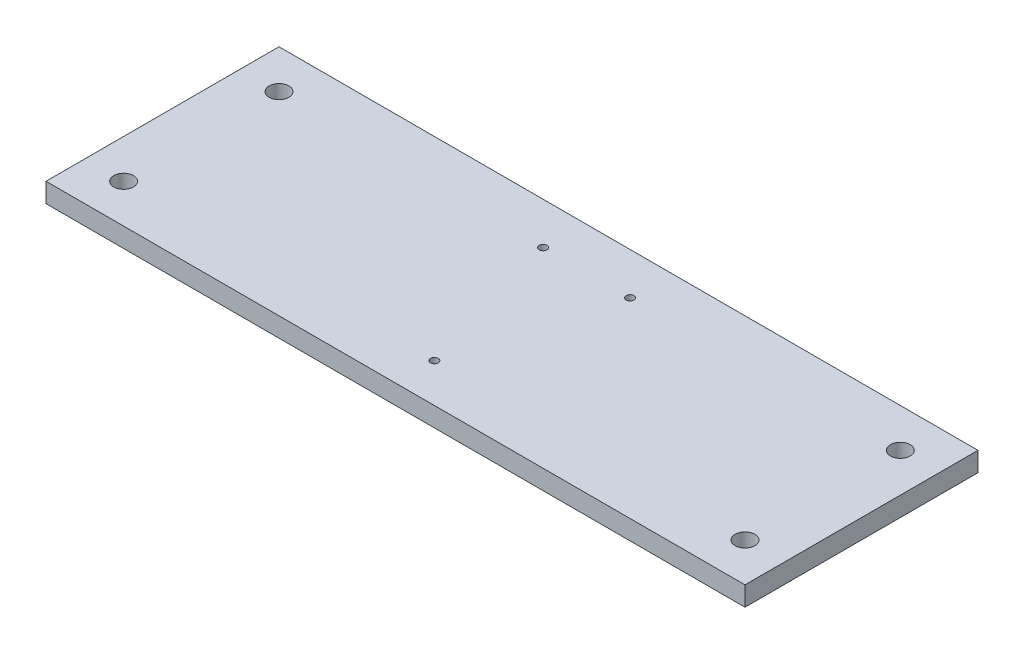
ISO-10303-21;
HEADER;
FILE_DESCRIPTION(('STEP AP214'),'2;1');
FILE_NAME('part.step','',(''),(''),'','','');
FILE_SCHEMA(('AUTOMOTIVE_DESIGN { 1 0 10303 214 1 1 1 1 }'));
ENDSEC;
DATA;
#1=APPLICATION_CONTEXT('core data for automotive mechanical design processes');
#2=APPLICATION_PROTOCOL_DEFINITION('international standard','automotive_design',2000,#1);
#3=PRODUCT_CONTEXT('',#1,'mechanical');
#4=PRODUCT('Part','Part','',(#3));
#5=PRODUCT_RELATED_PRODUCT_CATEGORY('part','',(#4));
#6=PRODUCT_DEFINITION_FORMATION('','',#4);
#7=PRODUCT_DEFINITION_CONTEXT('part definition',#1,'design');
#8=PRODUCT_DEFINITION('design','',#6,#7);
#9=PRODUCT_DEFINITION_SHAPE('','',#8);
#10=(LENGTH_UNIT() NAMED_UNIT(*) SI_UNIT(.MILLI.,.METRE.));
#11=(NAMED_UNIT(*) PLANE_ANGLE_UNIT() SI_UNIT($,.RADIAN.));
#12=(NAMED_UNIT(*) SI_UNIT($,.STERADIAN.) SOLID_ANGLE_UNIT());
#13=UNCERTAINTY_MEASURE_WITH_UNIT(LENGTH_MEASURE(1.E-05),#10,'distance_accuracy_value','');
#14=(GEOMETRIC_REPRESENTATION_CONTEXT(3) GLOBAL_UNCERTAINTY_ASSIGNED_CONTEXT((#13)) GLOBAL_UNIT_ASSIGNED_CONTEXT((#10,
#11,#12)) REPRESENTATION_CONTEXT('',''));
#15=CARTESIAN_POINT('',(0.,0.,0.));
#16=DIRECTION('',(0.,0.,1.));
#17=DIRECTION('',(1.,0.,0.));
#18=AXIS2_PLACEMENT_3D('',#15,#16,#17);
#19=CARTESIAN_POINT('',(0.,6.35,0.));
#20=DIRECTION('',(0.,1.,0.));
#21=DIRECTION('',(0.,0.,1.));
#22=AXIS2_PLACEMENT_3D('',#19,#20,#21);
#23=PLANE('',#22);
#24=CARTESIAN_POINT('',(101.600000000001,6.35,25.4000000000001));
#25=DIRECTION('',(0.,1.,0.));
#26=DIRECTION('',(0.,0.,1.));
#27=AXIS2_PLACEMENT_3D('',#24,#25,#26);
#28=CIRCLE('',#27,3.22807216755904);
#29=CARTESIAN_POINT('',(101.600000000001,6.35,28.6280721675591));
#30=VERTEX_POINT('',#29);
#31=EDGE_CURVE('E139',#30,#30,#28,.T.);
#32=ORIENTED_EDGE('',*,*,#31,.F.);
#33=EDGE_LOOP('',(#32));
#34=FACE_BOUND('',#33,.T.);
#35=CARTESIAN_POINT('',(-101.6,6.35,-25.3999999999999));
#36=DIRECTION('',(0.,1.,0.));
#37=DIRECTION('',(0.,0.,1.));
#38=AXIS2_PLACEMENT_3D('',#35,#36,#37);
#39=CIRCLE('',#38,3.22807216755905);
#40=CARTESIAN_POINT('',(-101.6,6.35,-22.1719278324409));
#41=VERTEX_POINT('',#40);
#42=EDGE_CURVE('E127',#41,#41,#39,.T.);
#43=ORIENTED_EDGE('',*,*,#42,.F.);
#44=EDGE_LOOP('',(#43));
#45=FACE_BOUND('',#44,.T.);
#46=CARTESIAN_POINT('',(14.226267712,6.35,-24.3941599999999));
#47=DIRECTION('',(0.,1.,0.));
#48=DIRECTION('',(0.,0.,1.));
#49=AXIS2_PLACEMENT_3D('',#46,#47,#48);
#50=CIRCLE('',#49,1.27);
#51=CARTESIAN_POINT('',(14.226267712,6.35,-23.1241599999999));
#52=VERTEX_POINT('',#51);
#53=EDGE_CURVE('E115',#52,#52,#50,.T.);
#54=ORIENTED_EDGE('',*,*,#53,.F.);
#55=EDGE_LOOP('',(#54));
#56=FACE_BOUND('',#55,.T.);
#57=DIRECTION('',(0.,0.,1.));
#58=VECTOR('',#57,1.);
#59=CARTESIAN_POINT('',(-114.3,6.35,38.1));
#60=LINE('',#59,#58);
#61=CARTESIAN_POINT('',(-114.3,6.35,-38.1));
#62=VERTEX_POINT('',#61);
#63=CARTESIAN_POINT('',(-114.3,6.35,38.1));
#64=VERTEX_POINT('',#63);
#65=EDGE_CURVE('E85',#62,#64,#60,.T.);
#66=ORIENTED_EDGE('',*,*,#65,.T.);
#67=DIRECTION('',(1.,0.,0.));
#68=VECTOR('',#67,1.);
#69=CARTESIAN_POINT('',(114.3,6.35,38.1));
#70=LINE('',#69,#68);
#71=CARTESIAN_POINT('',(114.3,6.35,38.1));
#72=VERTEX_POINT('',#71);
#73=EDGE_CURVE('E80',#64,#72,#70,.T.);
#74=ORIENTED_EDGE('',*,*,#73,.T.);
#75=DIRECTION('',(0.,0.,-1.));
#76=VECTOR('',#75,1.);
#77=CARTESIAN_POINT('',(114.3,6.35,38.1));
#78=LINE('',#77,#76);
#79=CARTESIAN_POINT('',(114.3,6.35,-38.1));
#80=VERTEX_POINT('',#79);
#81=EDGE_CURVE('E83',#72,#80,#78,.T.);
#82=ORIENTED_EDGE('',*,*,#81,.T.);
#83=DIRECTION('',(-1.,0.,0.));
#84=VECTOR('',#83,1.);
#85=CARTESIAN_POINT('',(114.3,6.35,-38.1));
#86=LINE('',#85,#84);
#87=EDGE_CURVE('E50',#80,#62,#86,.T.);
#88=ORIENTED_EDGE('',*,*,#87,.T.);
#89=EDGE_LOOP('',(#66,#74,#82,#88));
#90=FACE_BOUND('',#89,.T.);
#91=CARTESIAN_POINT('',(-14.226267712,6.35,-24.3941599999999));
#92=DIRECTION('',(0.,1.,0.));
#93=DIRECTION('',(0.,0.,1.));
#94=AXIS2_PLACEMENT_3D('',#91,#92,#93);
#95=CIRCLE('',#94,1.27);
#96=CARTESIAN_POINT('',(-14.226267712,6.35,-23.1241599999999));
#97=VERTEX_POINT('',#96);
#98=EDGE_CURVE('E100',#97,#97,#95,.T.);
#99=ORIENTED_EDGE('',*,*,#98,.F.);
#100=EDGE_LOOP('',(#99));
#101=FACE_BOUND('',#100,.T.);
#102=CARTESIAN_POINT('',(0.,6.35,25.4000000000001));
#103=DIRECTION('',(0.,1.,0.));
#104=DIRECTION('',(0.,0.,1.));
#105=AXIS2_PLACEMENT_3D('',#102,#103,#104);
#106=CIRCLE('',#105,1.27);
#107=CARTESIAN_POINT('',(0.,6.35,26.6700000000001));
#108=VERTEX_POINT('',#107);
#109=EDGE_CURVE('E121',#108,#108,#106,.T.);
#110=ORIENTED_EDGE('',*,*,#109,.F.);
#111=EDGE_LOOP('',(#110));
#112=FACE_BOUND('',#111,.T.);
#113=CARTESIAN_POINT('',(101.6,6.35,-25.3999999999999));
#114=DIRECTION('',(0.,1.,0.));
#115=DIRECTION('',(0.,0.,1.));
#116=AXIS2_PLACEMENT_3D('',#113,#114,#115);
#117=CIRCLE('',#116,3.22807216755904);
#118=CARTESIAN_POINT('',(101.6,6.35,-22.1719278324409));
#119=VERTEX_POINT('',#118);
#120=EDGE_CURVE('E133',#119,#119,#117,.T.);
#121=ORIENTED_EDGE('',*,*,#120,.F.);
#122=EDGE_LOOP('',(#121));
#123=FACE_BOUND('',#122,.T.);
#124=CARTESIAN_POINT('',(-101.599999999999,6.35,25.4000000000001));
#125=DIRECTION('',(0.,1.,0.));
#126=DIRECTION('',(0.,0.,1.));
#127=AXIS2_PLACEMENT_3D('',#124,#125,#126);
#128=CIRCLE('',#127,3.22807216755905);
#129=CARTESIAN_POINT('',(-101.599999999999,6.35,28.6280721675591));
#130=VERTEX_POINT('',#129);
#131=EDGE_CURVE('E145',#130,#130,#128,.T.);
#132=ORIENTED_EDGE('',*,*,#131,.F.);
#133=EDGE_LOOP('',(#132));
#134=FACE_BOUND('',#133,.T.);
#135=ADVANCED_FACE('F33',(#34,#45,#56,#90,#101,#112,#123,#134),#23,.T.);
#136=CARTESIAN_POINT('',(0.,0.,0.));
#137=DIRECTION('',(0.,1.,0.));
#138=DIRECTION('',(0.,0.,1.));
#139=AXIS2_PLACEMENT_3D('',#136,#137,#138);
#140=PLANE('',#139);
#141=DIRECTION('',(0.,0.,1.));
#142=VECTOR('',#141,1.);
#143=CARTESIAN_POINT('',(-114.3,0.,38.1));
#144=LINE('',#143,#142);
#145=CARTESIAN_POINT('',(-114.3,0.,-38.1));
#146=VERTEX_POINT('',#145);
#147=CARTESIAN_POINT('',(-114.3,0.,38.1));
#148=VERTEX_POINT('',#147);
#149=EDGE_CURVE('E97',#146,#148,#144,.T.);
#150=ORIENTED_EDGE('',*,*,#149,.F.);
#151=DIRECTION('',(-1.,0.,0.));
#152=VECTOR('',#151,1.);
#153=CARTESIAN_POINT('',(114.3,0.,-38.1));
#154=LINE('',#153,#152);
#155=CARTESIAN_POINT('',(114.3,0.,-38.1));
#156=VERTEX_POINT('',#155);
#157=EDGE_CURVE('E73',#156,#146,#154,.T.);
#158=ORIENTED_EDGE('',*,*,#157,.F.);
#159=DIRECTION('',(0.,0.,-1.));
#160=VECTOR('',#159,1.);
#161=CARTESIAN_POINT('',(114.3,0.,38.1));
#162=LINE('',#161,#160);
#163=CARTESIAN_POINT('',(114.3,0.,38.1));
#164=VERTEX_POINT('',#163);
#165=EDGE_CURVE('E67',#164,#156,#162,.T.);
#166=ORIENTED_EDGE('',*,*,#165,.F.);
#167=DIRECTION('',(1.,0.,0.));
#168=VECTOR('',#167,1.);
#169=CARTESIAN_POINT('',(114.3,0.,38.1));
#170=LINE('',#169,#168);
#171=EDGE_CURVE('E89',#148,#164,#170,.T.);
#172=ORIENTED_EDGE('',*,*,#171,.F.);
#173=EDGE_LOOP('',(#150,#158,#166,#172));
#174=FACE_BOUND('',#173,.T.);
#175=CARTESIAN_POINT('',(-14.226267712,0.,-24.3941599999999));
#176=DIRECTION('',(0.,1.,0.));
#177=DIRECTION('',(0.,0.,1.));
#178=AXIS2_PLACEMENT_3D('',#175,#176,#177);
#179=CIRCLE('',#178,1.27);
#180=CARTESIAN_POINT('',(-14.226267712,0.,-23.1241599999999));
#181=VERTEX_POINT('',#180);
#182=EDGE_CURVE('E112',#181,#181,#179,.T.);
#183=ORIENTED_EDGE('',*,*,#182,.T.);
#184=EDGE_LOOP('',(#183));
#185=FACE_BOUND('',#184,.T.);
#186=CARTESIAN_POINT('',(14.226267712,0.,-24.3941599999999));
#187=DIRECTION('',(0.,1.,0.));
#188=DIRECTION('',(0.,0.,1.));
#189=AXIS2_PLACEMENT_3D('',#186,#187,#188);
#190=CIRCLE('',#189,1.27);
#191=CARTESIAN_POINT('',(14.226267712,0.,-23.1241599999999));
#192=VERTEX_POINT('',#191);
#193=EDGE_CURVE('E118',#192,#192,#190,.T.);
#194=ORIENTED_EDGE('',*,*,#193,.T.);
#195=EDGE_LOOP('',(#194));
#196=FACE_BOUND('',#195,.T.);
#197=CARTESIAN_POINT('',(0.,0.,25.4000000000001));
#198=DIRECTION('',(0.,1.,0.));
#199=DIRECTION('',(0.,0.,1.));
#200=AXIS2_PLACEMENT_3D('',#197,#198,#199);
#201=CIRCLE('',#200,1.27);
#202=CARTESIAN_POINT('',(0.,0.,26.6700000000001));
#203=VERTEX_POINT('',#202);
#204=EDGE_CURVE('E124',#203,#203,#201,.T.);
#205=ORIENTED_EDGE('',*,*,#204,.T.);
#206=EDGE_LOOP('',(#205));
#207=FACE_BOUND('',#206,.T.);
#208=CARTESIAN_POINT('',(-101.6,0.,-25.3999999999999));
#209=DIRECTION('',(0.,1.,0.));
#210=DIRECTION('',(0.,0.,1.));
#211=AXIS2_PLACEMENT_3D('',#208,#209,#210);
#212=CIRCLE('',#211,3.22807216755905);
#213=CARTESIAN_POINT('',(-101.6,0.,-22.1719278324409));
#214=VERTEX_POINT('',#213);
#215=EDGE_CURVE('E130',#214,#214,#212,.T.);
#216=ORIENTED_EDGE('',*,*,#215,.T.);
#217=EDGE_LOOP('',(#216));
#218=FACE_BOUND('',#217,.T.);
#219=CARTESIAN_POINT('',(101.6,0.,-25.3999999999999));
#220=DIRECTION('',(0.,1.,0.));
#221=DIRECTION('',(0.,0.,1.));
#222=AXIS2_PLACEMENT_3D('',#219,#220,#221);
#223=CIRCLE('',#222,3.22807216755904);
#224=CARTESIAN_POINT('',(101.6,0.,-22.1719278324409));
#225=VERTEX_POINT('',#224);
#226=EDGE_CURVE('E136',#225,#225,#223,.T.);
#227=ORIENTED_EDGE('',*,*,#226,.T.);
#228=EDGE_LOOP('',(#227));
#229=FACE_BOUND('',#228,.T.);
#230=CARTESIAN_POINT('',(101.600000000001,0.,25.4000000000001));
#231=DIRECTION('',(0.,1.,0.));
#232=DIRECTION('',(0.,0.,1.));
#233=AXIS2_PLACEMENT_3D('',#230,#231,#232);
#234=CIRCLE('',#233,3.22807216755904);
#235=CARTESIAN_POINT('',(101.600000000001,0.,28.6280721675591));
#236=VERTEX_POINT('',#235);
#237=EDGE_CURVE('E142',#236,#236,#234,.T.);
#238=ORIENTED_EDGE('',*,*,#237,.T.);
#239=EDGE_LOOP('',(#238));
#240=FACE_BOUND('',#239,.T.);
#241=CARTESIAN_POINT('',(-101.599999999999,0.,25.4000000000001));
#242=DIRECTION('',(0.,1.,0.));
#243=DIRECTION('',(0.,0.,1.));
#244=AXIS2_PLACEMENT_3D('',#241,#242,#243);
#245=CIRCLE('',#244,3.22807216755905);
#246=CARTESIAN_POINT('',(-101.599999999999,0.,28.6280721675591));
#247=VERTEX_POINT('',#246);
#248=EDGE_CURVE('E148',#247,#247,#245,.T.);
#249=ORIENTED_EDGE('',*,*,#248,.T.);
#250=EDGE_LOOP('',(#249));
#251=FACE_BOUND('',#250,.T.);
#252=ADVANCED_FACE('F108',(#174,#185,#196,#207,#218,#229,#240,#251),#140,.F.);
#253=CARTESIAN_POINT('',(-114.3,6.35,38.1));
#254=DIRECTION('',(1.,0.,0.));
#255=DIRECTION('',(0.,0.,-1.));
#256=AXIS2_PLACEMENT_3D('',#253,#254,#255);
#257=PLANE('',#256);
#258=ORIENTED_EDGE('',*,*,#149,.T.);
#259=DIRECTION('',(0.,-1.,0.));
#260=VECTOR('',#259,1.);
#261=CARTESIAN_POINT('',(-114.3,6.35,38.1));
#262=LINE('',#261,#260);
#263=EDGE_CURVE('E11',#64,#148,#262,.T.);
#264=ORIENTED_EDGE('',*,*,#263,.F.);
#265=ORIENTED_EDGE('',*,*,#65,.F.);
#266=DIRECTION('',(0.,-1.,0.));
#267=VECTOR('',#266,1.);
#268=CARTESIAN_POINT('',(-114.3,6.35,-38.1));
#269=LINE('',#268,#267);
#270=EDGE_CURVE('E93',#62,#146,#269,.T.);
#271=ORIENTED_EDGE('',*,*,#270,.T.);
#272=EDGE_LOOP('',(#258,#264,#265,#271));
#273=FACE_BOUND('',#272,.T.);
#274=ADVANCED_FACE('F35',(#273),#257,.F.);
#275=CARTESIAN_POINT('',(114.3,6.35,38.1));
#276=DIRECTION('',(0.,0.,-1.));
#277=DIRECTION('',(-1.,0.,0.));
#278=AXIS2_PLACEMENT_3D('',#275,#276,#277);
#279=PLANE('',#278);
#280=ORIENTED_EDGE('',*,*,#171,.T.);
#281=DIRECTION('',(0.,-1.,0.));
#282=VECTOR('',#281,1.);
#283=CARTESIAN_POINT('',(114.3,6.35,38.1));
#284=LINE('',#283,#282);
#285=EDGE_CURVE('E42',#72,#164,#284,.T.);
#286=ORIENTED_EDGE('',*,*,#285,.F.);
#287=ORIENTED_EDGE('',*,*,#73,.F.);
#288=ORIENTED_EDGE('',*,*,#263,.T.);
#289=EDGE_LOOP('',(#280,#286,#287,#288));
#290=FACE_BOUND('',#289,.T.);
#291=ADVANCED_FACE('F88',(#290),#279,.F.);
#292=CARTESIAN_POINT('',(114.3,6.35,38.1));
#293=DIRECTION('',(-1.,0.,0.));
#294=DIRECTION('',(0.,0.,1.));
#295=AXIS2_PLACEMENT_3D('',#292,#293,#294);
#296=PLANE('',#295);
#297=ORIENTED_EDGE('',*,*,#165,.T.);
#298=DIRECTION('',(0.,-1.,0.));
#299=VECTOR('',#298,1.);
#300=CARTESIAN_POINT('',(114.3,6.35,-38.1));
#301=LINE('',#300,#299);
#302=EDGE_CURVE('E90',#80,#156,#301,.T.);
#303=ORIENTED_EDGE('',*,*,#302,.F.);
#304=ORIENTED_EDGE('',*,*,#81,.F.);
#305=ORIENTED_EDGE('',*,*,#285,.T.);
#306=EDGE_LOOP('',(#297,#303,#304,#305));
#307=FACE_BOUND('',#306,.T.);
#308=ADVANCED_FACE('F91',(#307),#296,.F.);
#309=CARTESIAN_POINT('',(114.3,6.35,-38.1));
#310=DIRECTION('',(0.,0.,1.));
#311=DIRECTION('',(1.,0.,0.));
#312=AXIS2_PLACEMENT_3D('',#309,#310,#311);
#313=PLANE('',#312);
#314=ORIENTED_EDGE('',*,*,#157,.T.);
#315=ORIENTED_EDGE('',*,*,#270,.F.);
#316=ORIENTED_EDGE('',*,*,#87,.F.);
#317=ORIENTED_EDGE('',*,*,#302,.T.);
#318=EDGE_LOOP('',(#314,#315,#316,#317));
#319=FACE_BOUND('',#318,.T.);
#320=ADVANCED_FACE('F105',(#319),#313,.F.);
#321=CARTESIAN_POINT('',(-14.226267712,6.35,-24.3941599999999));
#322=DIRECTION('',(0.,-1.,0.));
#323=DIRECTION('',(0.,0.,-1.));
#324=AXIS2_PLACEMENT_3D('',#321,#322,#323);
#325=CYLINDRICAL_SURFACE('',#324,1.27);
#326=ORIENTED_EDGE('',*,*,#98,.T.);
#327=EDGE_LOOP('',(#326));
#328=FACE_BOUND('',#327,.T.);
#329=ORIENTED_EDGE('',*,*,#182,.F.);
#330=EDGE_LOOP('',(#329));
#331=FACE_BOUND('',#330,.T.);
#332=ADVANCED_FACE('F167',(#328,#331),#325,.F.);
#333=CARTESIAN_POINT('',(14.226267712,6.35,-24.3941599999999));
#334=DIRECTION('',(0.,-1.,0.));
#335=DIRECTION('',(0.,0.,-1.));
#336=AXIS2_PLACEMENT_3D('',#333,#334,#335);
#337=CYLINDRICAL_SURFACE('',#336,1.27);
#338=ORIENTED_EDGE('',*,*,#53,.T.);
#339=EDGE_LOOP('',(#338));
#340=FACE_BOUND('',#339,.T.);
#341=ORIENTED_EDGE('',*,*,#193,.F.);
#342=EDGE_LOOP('',(#341));
#343=FACE_BOUND('',#342,.T.);
#344=ADVANCED_FACE('F213',(#340,#343),#337,.F.);
#345=CARTESIAN_POINT('',(0.,6.35,25.4000000000001));
#346=DIRECTION('',(0.,-1.,0.));
#347=DIRECTION('',(0.,0.,-1.));
#348=AXIS2_PLACEMENT_3D('',#345,#346,#347);
#349=CYLINDRICAL_SURFACE('',#348,1.27);
#350=ORIENTED_EDGE('',*,*,#109,.T.);
#351=EDGE_LOOP('',(#350));
#352=FACE_BOUND('',#351,.T.);
#353=ORIENTED_EDGE('',*,*,#204,.F.);
#354=EDGE_LOOP('',(#353));
#355=FACE_BOUND('',#354,.T.);
#356=ADVANCED_FACE('F221',(#352,#355),#349,.F.);
#357=CARTESIAN_POINT('',(-101.6,6.35,-25.3999999999999));
#358=DIRECTION('',(0.,-1.,0.));
#359=DIRECTION('',(0.,0.,-1.));
#360=AXIS2_PLACEMENT_3D('',#357,#358,#359);
#361=CYLINDRICAL_SURFACE('',#360,3.22807216755905);
#362=ORIENTED_EDGE('',*,*,#42,.T.);
#363=EDGE_LOOP('',(#362));
#364=FACE_BOUND('',#363,.T.);
#365=ORIENTED_EDGE('',*,*,#215,.F.);
#366=EDGE_LOOP('',(#365));
#367=FACE_BOUND('',#366,.T.);
#368=ADVANCED_FACE('F229',(#364,#367),#361,.F.);
#369=CARTESIAN_POINT('',(101.6,6.35,-25.3999999999999));
#370=DIRECTION('',(0.,-1.,0.));
#371=DIRECTION('',(0.,0.,-1.));
#372=AXIS2_PLACEMENT_3D('',#369,#370,#371);
#373=CYLINDRICAL_SURFACE('',#372,3.22807216755904);
#374=ORIENTED_EDGE('',*,*,#120,.T.);
#375=EDGE_LOOP('',(#374));
#376=FACE_BOUND('',#375,.T.);
#377=ORIENTED_EDGE('',*,*,#226,.F.);
#378=EDGE_LOOP('',(#377));
#379=FACE_BOUND('',#378,.T.);
#380=ADVANCED_FACE('F238',(#376,#379),#373,.F.);
#381=CARTESIAN_POINT('',(101.600000000001,6.35,25.4000000000001));
#382=DIRECTION('',(0.,-1.,0.));
#383=DIRECTION('',(0.,0.,-1.));
#384=AXIS2_PLACEMENT_3D('',#381,#382,#383);
#385=CYLINDRICAL_SURFACE('',#384,3.22807216755904);
#386=ORIENTED_EDGE('',*,*,#31,.T.);
#387=EDGE_LOOP('',(#386));
#388=FACE_BOUND('',#387,.T.);
#389=ORIENTED_EDGE('',*,*,#237,.F.);
#390=EDGE_LOOP('',(#389));
#391=FACE_BOUND('',#390,.T.);
#392=ADVANCED_FACE('F247',(#388,#391),#385,.F.);
#393=CARTESIAN_POINT('',(-101.599999999999,6.35,25.4000000000001));
#394=DIRECTION('',(0.,-1.,0.));
#395=DIRECTION('',(0.,0.,-1.));
#396=AXIS2_PLACEMENT_3D('',#393,#394,#395);
#397=CYLINDRICAL_SURFACE('',#396,3.22807216755905);
#398=ORIENTED_EDGE('',*,*,#131,.T.);
#399=EDGE_LOOP('',(#398));
#400=FACE_BOUND('',#399,.T.);
#401=ORIENTED_EDGE('',*,*,#248,.F.);
#402=EDGE_LOOP('',(#401));
#403=FACE_BOUND('',#402,.T.);
#404=ADVANCED_FACE('F154',(#400,#403),#397,.F.);
#405=CLOSED_SHELL('',(#135,#252,#274,#291,#308,#320,#332,#344,#356,#368,#380,#392,#404));
#406=MANIFOLD_SOLID_BREP('B2',#405);
#407=ADVANCED_BREP_SHAPE_REPRESENTATION('',(#18,#406),#14);
#408=SHAPE_DEFINITION_REPRESENTATION(#9,#407);
ENDSEC;
END-ISO-10303-21;
